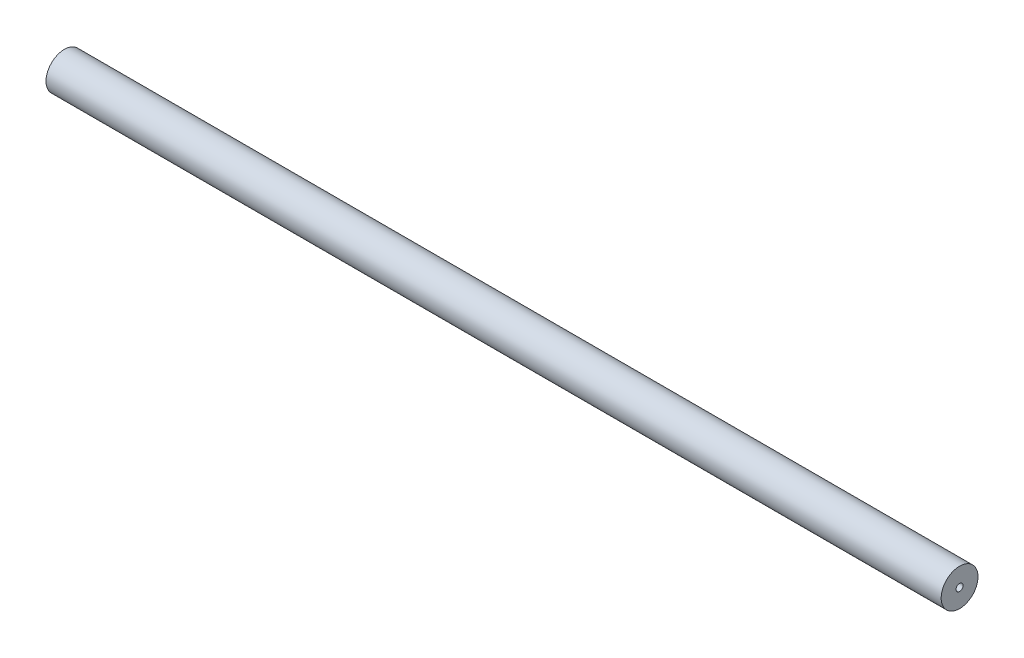
ISO-10303-21;
HEADER;
FILE_DESCRIPTION(('STEP AP214'),'2;1');
FILE_NAME('part.step','',(''),(''),'','','');
FILE_SCHEMA(('AUTOMOTIVE_DESIGN { 1 0 10303 214 1 1 1 1 }'));
ENDSEC;
DATA;
#1=APPLICATION_CONTEXT('core data for automotive mechanical design processes');
#2=APPLICATION_PROTOCOL_DEFINITION('international standard','automotive_design',2000,#1);
#3=PRODUCT_CONTEXT('',#1,'mechanical');
#4=PRODUCT('Part','Part','',(#3));
#5=PRODUCT_RELATED_PRODUCT_CATEGORY('part','',(#4));
#6=PRODUCT_DEFINITION_FORMATION('','',#4);
#7=PRODUCT_DEFINITION_CONTEXT('part definition',#1,'design');
#8=PRODUCT_DEFINITION('design','',#6,#7);
#9=PRODUCT_DEFINITION_SHAPE('','',#8);
#10=(LENGTH_UNIT() NAMED_UNIT(*) SI_UNIT(.MILLI.,.METRE.));
#11=(NAMED_UNIT(*) PLANE_ANGLE_UNIT() SI_UNIT($,.RADIAN.));
#12=(NAMED_UNIT(*) SI_UNIT($,.STERADIAN.) SOLID_ANGLE_UNIT());
#13=UNCERTAINTY_MEASURE_WITH_UNIT(LENGTH_MEASURE(1.E-05),#10,'distance_accuracy_value','');
#14=(GEOMETRIC_REPRESENTATION_CONTEXT(3) GLOBAL_UNCERTAINTY_ASSIGNED_CONTEXT((#13)) GLOBAL_UNIT_ASSIGNED_CONTEXT((#10,
#11,#12)) REPRESENTATION_CONTEXT('',''));
#15=CARTESIAN_POINT('',(0.,0.,0.));
#16=DIRECTION('',(0.,0.,1.));
#17=DIRECTION('',(1.,0.,0.));
#18=AXIS2_PLACEMENT_3D('',#15,#16,#17);
#19=CARTESIAN_POINT('',(-69.117222471056,0.,0.));
#20=DIRECTION('',(-1.,0.,0.));
#21=DIRECTION('',(0.,-1.,0.));
#22=AXIS2_PLACEMENT_3D('',#19,#20,#21);
#23=CYLINDRICAL_SURFACE('',#22,2.35000000000001);
#24=CARTESIAN_POINT('',(300.,0.,0.));
#25=DIRECTION('',(-1.,0.,0.));
#26=DIRECTION('',(0.,-1.,0.));
#27=AXIS2_PLACEMENT_3D('',#24,#25,#26);
#28=CIRCLE('',#27,2.34999999999995);
#29=CARTESIAN_POINT('',(300.,-2.34999999999991,0.));
#30=VERTEX_POINT('',#29);
#31=EDGE_CURVE('E45',#30,#30,#28,.T.);
#32=ORIENTED_EDGE('',*,*,#31,.F.);
#33=EDGE_LOOP('',(#32));
#34=FACE_BOUND('',#33,.T.);
#35=CARTESIAN_POINT('',(-300.,0.,0.));
#36=DIRECTION('',(-1.,0.,0.));
#37=DIRECTION('',(0.,-1.,0.));
#38=AXIS2_PLACEMENT_3D('',#35,#36,#37);
#39=CIRCLE('',#38,2.35000000000006);
#40=CARTESIAN_POINT('',(-300.,-2.35000000000013,0.));
#41=VERTEX_POINT('',#40);
#42=EDGE_CURVE('E10',#41,#41,#39,.T.);
#43=ORIENTED_EDGE('',*,*,#42,.T.);
#44=EDGE_LOOP('',(#43));
#45=FACE_BOUND('',#44,.T.);
#46=ADVANCED_FACE('F31',(#34,#45),#23,.F.);
#47=CARTESIAN_POINT('',(-300.,2.35,0.));
#48=DIRECTION('',(-1.,0.,0.));
#49=DIRECTION('',(0.,-1.,0.));
#50=AXIS2_PLACEMENT_3D('',#47,#48,#49);
#51=PLANE('',#50);
#52=CARTESIAN_POINT('',(-300.,0.,0.));
#53=DIRECTION('',(-1.,0.,0.));
#54=DIRECTION('',(0.,-1.,0.));
#55=AXIS2_PLACEMENT_3D('',#52,#53,#54);
#56=CIRCLE('',#55,12.3500000000001);
#57=CARTESIAN_POINT('',(-300.,-12.3500000000001,0.));
#58=VERTEX_POINT('',#57);
#59=EDGE_CURVE('E37',#58,#58,#56,.T.);
#60=ORIENTED_EDGE('',*,*,#59,.T.);
#61=EDGE_LOOP('',(#60));
#62=FACE_BOUND('',#61,.T.);
#63=ORIENTED_EDGE('',*,*,#42,.F.);
#64=EDGE_LOOP('',(#63));
#65=FACE_BOUND('',#64,.T.);
#66=ADVANCED_FACE('F55',(#62,#65),#51,.T.);
#67=CARTESIAN_POINT('',(-69.117222471056,0.,0.));
#68=DIRECTION('',(-1.,0.,0.));
#69=DIRECTION('',(0.,-1.,0.));
#70=AXIS2_PLACEMENT_3D('',#67,#68,#69);
#71=CYLINDRICAL_SURFACE('',#70,12.35);
#72=CARTESIAN_POINT('',(300.,0.,0.));
#73=DIRECTION('',(-1.,0.,0.));
#74=DIRECTION('',(0.,-1.,0.));
#75=AXIS2_PLACEMENT_3D('',#72,#73,#74);
#76=CIRCLE('',#75,12.35);
#77=CARTESIAN_POINT('',(300.,-12.3499999999999,0.));
#78=VERTEX_POINT('',#77);
#79=EDGE_CURVE('E41',#78,#78,#76,.T.);
#80=ORIENTED_EDGE('',*,*,#79,.T.);
#81=EDGE_LOOP('',(#80));
#82=FACE_BOUND('',#81,.T.);
#83=ORIENTED_EDGE('',*,*,#59,.F.);
#84=EDGE_LOOP('',(#83));
#85=FACE_BOUND('',#84,.T.);
#86=ADVANCED_FACE('F59',(#82,#85),#71,.T.);
#87=CARTESIAN_POINT('',(300.,12.35,0.));
#88=DIRECTION('',(1.,0.,0.));
#89=DIRECTION('',(0.,1.,0.));
#90=AXIS2_PLACEMENT_3D('',#87,#88,#89);
#91=PLANE('',#90);
#92=ORIENTED_EDGE('',*,*,#31,.T.);
#93=EDGE_LOOP('',(#92));
#94=FACE_BOUND('',#93,.T.);
#95=ORIENTED_EDGE('',*,*,#79,.F.);
#96=EDGE_LOOP('',(#95));
#97=FACE_BOUND('',#96,.T.);
#98=ADVANCED_FACE('F51',(#94,#97),#91,.T.);
#99=CLOSED_SHELL('',(#46,#66,#86,#98));
#100=MANIFOLD_SOLID_BREP('B2',#99);
#101=ADVANCED_BREP_SHAPE_REPRESENTATION('',(#18,#100),#14);
#102=SHAPE_DEFINITION_REPRESENTATION(#9,#101);
ENDSEC;
END-ISO-10303-21;
